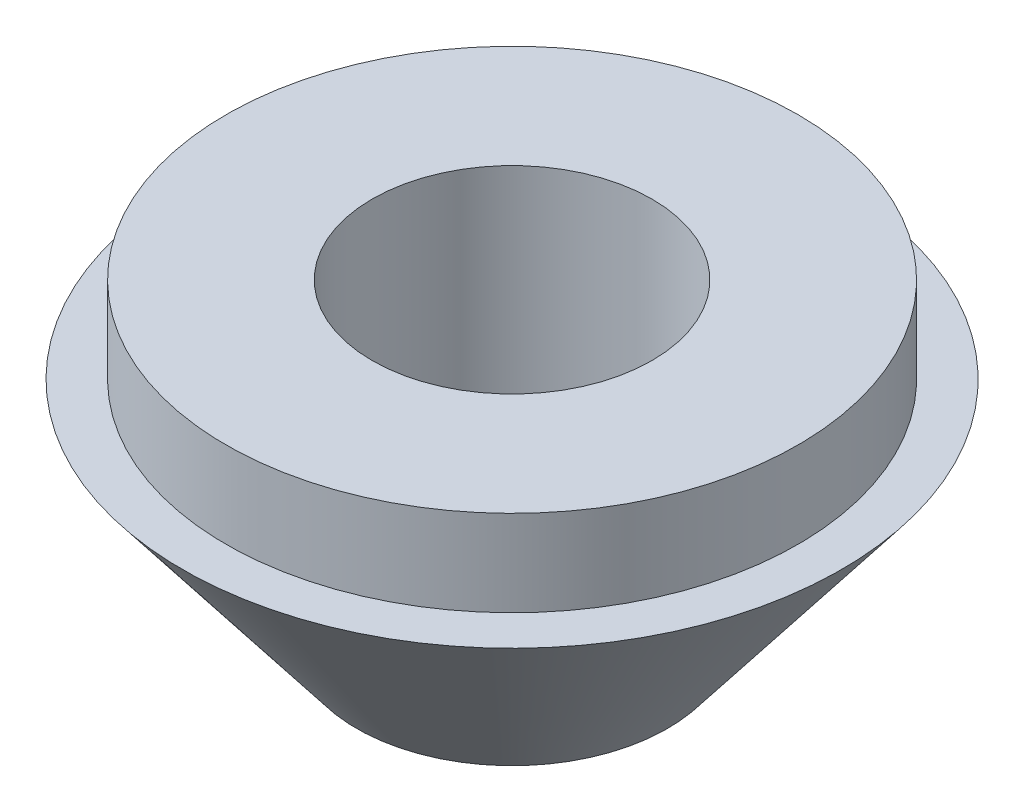
ISO-10303-21;
HEADER;
FILE_DESCRIPTION(('STEP AP214'),'2;1');
FILE_NAME('part.step','',(''),(''),'','','');
FILE_SCHEMA(('AUTOMOTIVE_DESIGN { 1 0 10303 214 1 1 1 1 }'));
ENDSEC;
DATA;
#1=APPLICATION_CONTEXT('core data for automotive mechanical design processes');
#2=APPLICATION_PROTOCOL_DEFINITION('international standard','automotive_design',2000,#1);
#3=PRODUCT_CONTEXT('',#1,'mechanical');
#4=PRODUCT('Part','Part','',(#3));
#5=PRODUCT_RELATED_PRODUCT_CATEGORY('part','',(#4));
#6=PRODUCT_DEFINITION_FORMATION('','',#4);
#7=PRODUCT_DEFINITION_CONTEXT('part definition',#1,'design');
#8=PRODUCT_DEFINITION('design','',#6,#7);
#9=PRODUCT_DEFINITION_SHAPE('','',#8);
#10=(LENGTH_UNIT() NAMED_UNIT(*) SI_UNIT(.MILLI.,.METRE.));
#11=(NAMED_UNIT(*) PLANE_ANGLE_UNIT() SI_UNIT($,.RADIAN.));
#12=(NAMED_UNIT(*) SI_UNIT($,.STERADIAN.) SOLID_ANGLE_UNIT());
#13=UNCERTAINTY_MEASURE_WITH_UNIT(LENGTH_MEASURE(1.E-05),#10,'distance_accuracy_value','');
#14=(GEOMETRIC_REPRESENTATION_CONTEXT(3) GLOBAL_UNCERTAINTY_ASSIGNED_CONTEXT((#13)) GLOBAL_UNIT_ASSIGNED_CONTEXT((#10,
#11,#12)) REPRESENTATION_CONTEXT('',''));
#15=CARTESIAN_POINT('',(0.,0.,0.));
#16=DIRECTION('',(0.,0.,1.));
#17=DIRECTION('',(1.,0.,0.));
#18=AXIS2_PLACEMENT_3D('',#15,#16,#17);
#19=CARTESIAN_POINT('',(-6.35,0.,0.));
#20=DIRECTION('',(0.,1.,0.));
#21=DIRECTION('',(0.,0.,1.));
#22=AXIS2_PLACEMENT_3D('',#19,#20,#21);
#23=PLANE('',#22);
#24=CARTESIAN_POINT('',(0.,0.,0.));
#25=DIRECTION('',(0.,1.,0.));
#26=DIRECTION('',(0.,0.,1.));
#27=AXIS2_PLACEMENT_3D('',#24,#25,#26);
#28=CIRCLE('',#27,5.715);
#29=CARTESIAN_POINT('',(0.,0.,5.715));
#30=VERTEX_POINT('',#29);
#31=EDGE_CURVE('E60',#30,#30,#28,.T.);
#32=ORIENTED_EDGE('',*,*,#31,.T.);
#33=EDGE_LOOP('',(#32));
#34=FACE_BOUND('',#33,.T.);
#35=CARTESIAN_POINT('',(0.,0.,0.));
#36=DIRECTION('',(0.,-1.,0.));
#37=DIRECTION('',(0.,0.,-1.));
#38=AXIS2_PLACEMENT_3D('',#35,#36,#37);
#39=CIRCLE('',#38,6.35);
#40=CARTESIAN_POINT('',(0.,0.,-6.35));
#41=VERTEX_POINT('',#40);
#42=EDGE_CURVE('E54',#41,#41,#39,.T.);
#43=ORIENTED_EDGE('',*,*,#42,.T.);
#44=EDGE_LOOP('',(#43));
#45=FACE_BOUND('',#44,.T.);
#46=ADVANCED_FACE('F37',(#34,#45),#23,.F.);
#47=CARTESIAN_POINT('',(0.,12.7,0.));
#48=DIRECTION('',(0.,-1.,0.));
#49=DIRECTION('',(0.,0.,-1.));
#50=AXIS2_PLACEMENT_3D('',#47,#48,#49);
#51=PLANE('',#50);
#52=CARTESIAN_POINT('',(0.,12.7,0.));
#53=DIRECTION('',(0.,1.,0.));
#54=DIRECTION('',(0.,0.,1.));
#55=AXIS2_PLACEMENT_3D('',#52,#53,#54);
#56=CIRCLE('',#55,5.715);
#57=CARTESIAN_POINT('',(0.,12.7,5.715));
#58=VERTEX_POINT('',#57);
#59=EDGE_CURVE('E61',#58,#58,#56,.T.);
#60=ORIENTED_EDGE('',*,*,#59,.F.);
#61=EDGE_LOOP('',(#60));
#62=FACE_BOUND('',#61,.T.);
#63=CARTESIAN_POINT('',(0.,12.7,0.));
#64=DIRECTION('',(0.,-1.,0.));
#65=DIRECTION('',(0.,0.,-1.));
#66=AXIS2_PLACEMENT_3D('',#63,#64,#65);
#67=CIRCLE('',#66,11.684);
#68=CARTESIAN_POINT('',(0.,12.7,-11.684));
#69=VERTEX_POINT('',#68);
#70=EDGE_CURVE('E10',#69,#69,#67,.T.);
#71=ORIENTED_EDGE('',*,*,#70,.F.);
#72=EDGE_LOOP('',(#71));
#73=FACE_BOUND('',#72,.T.);
#74=ADVANCED_FACE('F78',(#62,#73),#51,.F.);
#75=CARTESIAN_POINT('',(0.,0.,0.));
#76=DIRECTION('',(0.,-1.,0.));
#77=DIRECTION('',(0.,0.,-1.));
#78=AXIS2_PLACEMENT_3D('',#75,#76,#77);
#79=CYLINDRICAL_SURFACE('',#78,11.684);
#80=CARTESIAN_POINT('',(0.,9.18378870673953,0.));
#81=DIRECTION('',(0.,-1.,0.));
#82=DIRECTION('',(0.,0.,-1.));
#83=AXIS2_PLACEMENT_3D('',#80,#81,#82);
#84=CIRCLE('',#83,11.684);
#85=CARTESIAN_POINT('',(0.,9.18378870673953,-11.684));
#86=VERTEX_POINT('',#85);
#87=EDGE_CURVE('E44',#86,#86,#84,.T.);
#88=ORIENTED_EDGE('',*,*,#87,.F.);
#89=EDGE_LOOP('',(#88));
#90=FACE_BOUND('',#89,.T.);
#91=ORIENTED_EDGE('',*,*,#70,.T.);
#92=EDGE_LOOP('',(#91));
#93=FACE_BOUND('',#92,.T.);
#94=ADVANCED_FACE('F81',(#90,#93),#79,.T.);
#95=CARTESIAN_POINT('',(-11.684,9.18378870673953,0.));
#96=DIRECTION('',(0.,-1.,0.));
#97=DIRECTION('',(0.,0.,-1.));
#98=AXIS2_PLACEMENT_3D('',#95,#96,#97);
#99=PLANE('',#98);
#100=CARTESIAN_POINT('',(0.,9.18378870673953,0.));
#101=DIRECTION('',(0.,-1.,0.));
#102=DIRECTION('',(0.,0.,-1.));
#103=AXIS2_PLACEMENT_3D('',#100,#101,#102);
#104=CIRCLE('',#103,13.462);
#105=CARTESIAN_POINT('',(0.,9.18378870673953,-13.462));
#106=VERTEX_POINT('',#105);
#107=EDGE_CURVE('E49',#106,#106,#104,.T.);
#108=ORIENTED_EDGE('',*,*,#107,.F.);
#109=EDGE_LOOP('',(#108));
#110=FACE_BOUND('',#109,.T.);
#111=ORIENTED_EDGE('',*,*,#87,.T.);
#112=EDGE_LOOP('',(#111));
#113=FACE_BOUND('',#112,.T.);
#114=ADVANCED_FACE('F86',(#110,#113),#99,.F.);
#115=CARTESIAN_POINT('',(0.,9.18378870673953,0.));
#116=DIRECTION('',(0.,1.,0.));
#117=DIRECTION('',(0.,0.,1.));
#118=AXIS2_PLACEMENT_3D('',#115,#116,#117);
#119=CONICAL_SURFACE('',#118,13.462,0.658940144569772);
#120=ORIENTED_EDGE('',*,*,#42,.F.);
#121=EDGE_LOOP('',(#120));
#122=FACE_BOUND('',#121,.T.);
#123=ORIENTED_EDGE('',*,*,#107,.T.);
#124=EDGE_LOOP('',(#123));
#125=FACE_BOUND('',#124,.T.);
#126=ADVANCED_FACE('F74',(#122,#125),#119,.T.);
#127=CARTESIAN_POINT('',(0.,0.,0.));
#128=DIRECTION('',(0.,1.,0.));
#129=DIRECTION('',(0.,0.,1.));
#130=AXIS2_PLACEMENT_3D('',#127,#128,#129);
#131=CYLINDRICAL_SURFACE('',#130,5.715);
#132=ORIENTED_EDGE('',*,*,#31,.F.);
#133=EDGE_LOOP('',(#132));
#134=FACE_BOUND('',#133,.T.);
#135=ORIENTED_EDGE('',*,*,#59,.T.);
#136=EDGE_LOOP('',(#135));
#137=FACE_BOUND('',#136,.T.);
#138=ADVANCED_FACE('F71',(#134,#137),#131,.F.);
#139=CLOSED_SHELL('',(#46,#74,#94,#114,#126,#138));
#140=MANIFOLD_SOLID_BREP('B2',#139);
#141=ADVANCED_BREP_SHAPE_REPRESENTATION('',(#18,#140),#14);
#142=SHAPE_DEFINITION_REPRESENTATION(#9,#141);
ENDSEC;
END-ISO-10303-21;
